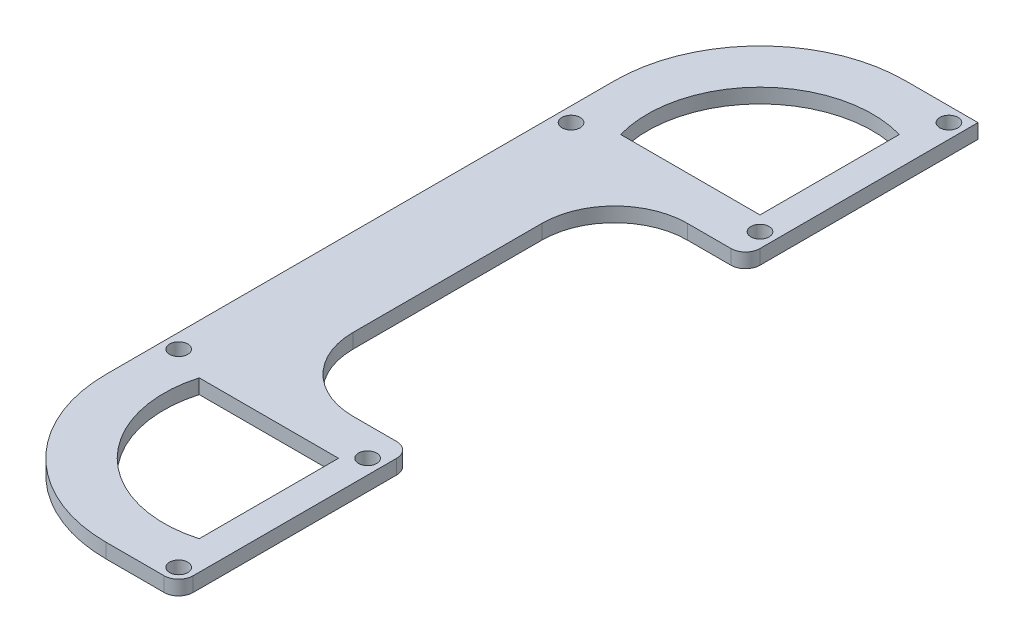
ISO-10303-21;
HEADER;
FILE_DESCRIPTION(('STEP AP214'),'2;1');
FILE_NAME('part.step','',(''),(''),'','','');
FILE_SCHEMA(('AUTOMOTIVE_DESIGN { 1 0 10303 214 1 1 1 1 }'));
ENDSEC;
DATA;
#1=APPLICATION_CONTEXT('core data for automotive mechanical design processes');
#2=APPLICATION_PROTOCOL_DEFINITION('international standard','automotive_design',2000,#1);
#3=PRODUCT_CONTEXT('',#1,'mechanical');
#4=PRODUCT('Part','Part','',(#3));
#5=PRODUCT_RELATED_PRODUCT_CATEGORY('part','',(#4));
#6=PRODUCT_DEFINITION_FORMATION('','',#4);
#7=PRODUCT_DEFINITION_CONTEXT('part definition',#1,'design');
#8=PRODUCT_DEFINITION('design','',#6,#7);
#9=PRODUCT_DEFINITION_SHAPE('','',#8);
#10=(LENGTH_UNIT() NAMED_UNIT(*) SI_UNIT(.MILLI.,.METRE.));
#11=(NAMED_UNIT(*) PLANE_ANGLE_UNIT() SI_UNIT($,.RADIAN.));
#12=(NAMED_UNIT(*) SI_UNIT($,.STERADIAN.) SOLID_ANGLE_UNIT());
#13=UNCERTAINTY_MEASURE_WITH_UNIT(LENGTH_MEASURE(1.E-05),#10,'distance_accuracy_value','');
#14=(GEOMETRIC_REPRESENTATION_CONTEXT(3) GLOBAL_UNCERTAINTY_ASSIGNED_CONTEXT((#13)) GLOBAL_UNIT_ASSIGNED_CONTEXT((#10,
#11,#12)) REPRESENTATION_CONTEXT('',''));
#15=CARTESIAN_POINT('',(0.,0.,0.));
#16=DIRECTION('',(0.,0.,1.));
#17=DIRECTION('',(1.,0.,0.));
#18=AXIS2_PLACEMENT_3D('',#15,#16,#17);
#19=CARTESIAN_POINT('',(15.,2.,-55.));
#20=DIRECTION('',(-1.,0.,0.));
#21=DIRECTION('',(0.,0.,1.));
#22=AXIS2_PLACEMENT_3D('',#19,#20,#21);
#23=PLANE('',#22);
#24=DIRECTION('',(0.,0.,-1.));
#25=VECTOR('',#24,1.);
#26=CARTESIAN_POINT('',(15.,2.,-55.));
#27=LINE('',#26,#25);
#28=CARTESIAN_POINT('',(15.,2.,-25.));
#29=VERTEX_POINT('',#28);
#30=CARTESIAN_POINT('',(15.,2.,-55.));
#31=VERTEX_POINT('',#30);
#32=EDGE_CURVE('E308',#29,#31,#27,.T.);
#33=ORIENTED_EDGE('',*,*,#32,.F.);
#34=DIRECTION('',(0.,1.,0.));
#35=VECTOR('',#34,1.);
#36=CARTESIAN_POINT('',(15.,2.,-25.));
#37=LINE('',#36,#35);
#38=CARTESIAN_POINT('',(15.,0.,-25.));
#39=VERTEX_POINT('',#38);
#40=EDGE_CURVE('E430',#29,#39,#37,.F.);
#41=ORIENTED_EDGE('',*,*,#40,.T.);
#42=DIRECTION('',(0.,0.,-1.));
#43=VECTOR('',#42,1.);
#44=CARTESIAN_POINT('',(15.,0.,-55.));
#45=LINE('',#44,#43);
#46=CARTESIAN_POINT('',(15.,0.,-55.));
#47=VERTEX_POINT('',#46);
#48=EDGE_CURVE('E299',#39,#47,#45,.T.);
#49=ORIENTED_EDGE('',*,*,#48,.T.);
#50=DIRECTION('',(0.,-1.,0.));
#51=VECTOR('',#50,1.);
#52=CARTESIAN_POINT('',(15.,2.,-55.));
#53=LINE('',#52,#51);
#54=EDGE_CURVE('E320',#31,#47,#53,.T.);
#55=ORIENTED_EDGE('',*,*,#54,.F.);
#56=EDGE_LOOP('',(#33,#41,#49,#55));
#57=FACE_BOUND('',#56,.T.);
#58=ADVANCED_FACE('F38',(#57),#23,.F.);
#59=CARTESIAN_POINT('',(15.,0.,53.));
#60=VERTEX_POINT('',#59);
#61=CARTESIAN_POINT('',(15.,0.,25.));
#62=VERTEX_POINT('',#61);
#63=EDGE_CURVE('E321',#60,#62,#45,.T.);
#64=ORIENTED_EDGE('',*,*,#63,.T.);
#65=DIRECTION('',(0.,1.,0.));
#66=VECTOR('',#65,1.);
#67=CARTESIAN_POINT('',(15.,2.,25.));
#68=LINE('',#67,#66);
#69=CARTESIAN_POINT('',(15.,2.,25.));
#70=VERTEX_POINT('',#69);
#71=EDGE_CURVE('E407',#62,#70,#68,.T.);
#72=ORIENTED_EDGE('',*,*,#71,.T.);
#73=CARTESIAN_POINT('',(15.,2.,53.));
#74=VERTEX_POINT('',#73);
#75=EDGE_CURVE('E303',#74,#70,#27,.T.);
#76=ORIENTED_EDGE('',*,*,#75,.F.);
#77=DIRECTION('',(0.,-1.,0.));
#78=VECTOR('',#77,1.);
#79=CARTESIAN_POINT('',(15.,2.,53.));
#80=LINE('',#79,#78);
#81=EDGE_CURVE('E366',#74,#60,#80,.T.);
#82=ORIENTED_EDGE('',*,*,#81,.T.);
#83=EDGE_LOOP('',(#64,#72,#76,#82));
#84=FACE_BOUND('',#83,.T.);
#85=ADVANCED_FACE('F466',(#84),#23,.F.);
#86=CARTESIAN_POINT('',(-15.,2.,-55.));
#87=DIRECTION('',(0.,0.,1.));
#88=DIRECTION('',(1.,0.,0.));
#89=AXIS2_PLACEMENT_3D('',#86,#87,#88);
#90=PLANE('',#89);
#91=DIRECTION('',(-1.,0.,0.));
#92=VECTOR('',#91,1.);
#93=CARTESIAN_POINT('',(-15.,0.,-55.));
#94=LINE('',#93,#92);
#95=CARTESIAN_POINT('',(5.,0.,-55.));
#96=VERTEX_POINT('',#95);
#97=EDGE_CURVE('E325',#47,#96,#94,.T.);
#98=ORIENTED_EDGE('',*,*,#97,.T.);
#99=DIRECTION('',(0.,-1.,0.));
#100=VECTOR('',#99,1.);
#101=CARTESIAN_POINT('',(5.,2.,-55.));
#102=LINE('',#101,#100);
#103=CARTESIAN_POINT('',(5.,2.,-55.));
#104=VERTEX_POINT('',#103);
#105=EDGE_CURVE('E363',#96,#104,#102,.F.);
#106=ORIENTED_EDGE('',*,*,#105,.T.);
#107=DIRECTION('',(-1.,0.,0.));
#108=VECTOR('',#107,1.);
#109=CARTESIAN_POINT('',(-15.,2.,-55.));
#110=LINE('',#109,#108);
#111=EDGE_CURVE('E307',#31,#104,#110,.T.);
#112=ORIENTED_EDGE('',*,*,#111,.F.);
#113=ORIENTED_EDGE('',*,*,#54,.T.);
#114=EDGE_LOOP('',(#98,#106,#112,#113));
#115=FACE_BOUND('',#114,.T.);
#116=ADVANCED_FACE('F473',(#115),#90,.F.);
#117=CARTESIAN_POINT('',(-15.,2.,-55.));
#118=DIRECTION('',(1.,0.,0.));
#119=DIRECTION('',(0.,0.,-1.));
#120=AXIS2_PLACEMENT_3D('',#117,#118,#119);
#121=PLANE('',#120);
#122=DIRECTION('',(0.,0.,1.));
#123=VECTOR('',#122,1.);
#124=CARTESIAN_POINT('',(-15.,0.,-55.));
#125=LINE('',#124,#123);
#126=CARTESIAN_POINT('',(-15.,0.,-35.));
#127=VERTEX_POINT('',#126);
#128=CARTESIAN_POINT('',(-15.,0.,35.));
#129=VERTEX_POINT('',#128);
#130=EDGE_CURVE('E329',#127,#129,#125,.T.);
#131=ORIENTED_EDGE('',*,*,#130,.T.);
#132=DIRECTION('',(0.,-1.,0.));
#133=VECTOR('',#132,1.);
#134=CARTESIAN_POINT('',(-15.,2.,35.));
#135=LINE('',#134,#133);
#136=CARTESIAN_POINT('',(-15.,2.,35.));
#137=VERTEX_POINT('',#136);
#138=EDGE_CURVE('E354',#129,#137,#135,.F.);
#139=ORIENTED_EDGE('',*,*,#138,.T.);
#140=DIRECTION('',(0.,0.,1.));
#141=VECTOR('',#140,1.);
#142=CARTESIAN_POINT('',(-15.,2.,-55.));
#143=LINE('',#142,#141);
#144=CARTESIAN_POINT('',(-15.,2.,-35.));
#145=VERTEX_POINT('',#144);
#146=EDGE_CURVE('E312',#145,#137,#143,.T.);
#147=ORIENTED_EDGE('',*,*,#146,.F.);
#148=DIRECTION('',(0.,-1.,0.));
#149=VECTOR('',#148,1.);
#150=CARTESIAN_POINT('',(-15.,2.,-35.));
#151=LINE('',#150,#149);
#152=EDGE_CURVE('E350',#145,#127,#151,.T.);
#153=ORIENTED_EDGE('',*,*,#152,.T.);
#154=EDGE_LOOP('',(#131,#139,#147,#153));
#155=FACE_BOUND('',#154,.T.);
#156=ADVANCED_FACE('F529',(#155),#121,.F.);
#157=CARTESIAN_POINT('',(-15.,2.,55.));
#158=DIRECTION('',(0.,0.,-1.));
#159=DIRECTION('',(-1.,0.,0.));
#160=AXIS2_PLACEMENT_3D('',#157,#158,#159);
#161=PLANE('',#160);
#162=DIRECTION('',(1.,0.,0.));
#163=VECTOR('',#162,1.);
#164=CARTESIAN_POINT('',(-15.,0.,55.));
#165=LINE('',#164,#163);
#166=CARTESIAN_POINT('',(5.,0.,55.));
#167=VERTEX_POINT('',#166);
#168=CARTESIAN_POINT('',(13.,0.,55.));
#169=VERTEX_POINT('',#168);
#170=EDGE_CURVE('E333',#167,#169,#165,.T.);
#171=ORIENTED_EDGE('',*,*,#170,.T.);
#172=DIRECTION('',(0.,-1.,0.));
#173=VECTOR('',#172,1.);
#174=CARTESIAN_POINT('',(13.,2.,55.));
#175=LINE('',#174,#173);
#176=CARTESIAN_POINT('',(13.,2.,55.));
#177=VERTEX_POINT('',#176);
#178=EDGE_CURVE('E373',#169,#177,#175,.F.);
#179=ORIENTED_EDGE('',*,*,#178,.T.);
#180=DIRECTION('',(1.,0.,0.));
#181=VECTOR('',#180,1.);
#182=CARTESIAN_POINT('',(-15.,2.,55.));
#183=LINE('',#182,#181);
#184=CARTESIAN_POINT('',(5.,2.,55.));
#185=VERTEX_POINT('',#184);
#186=EDGE_CURVE('E316',#185,#177,#183,.T.);
#187=ORIENTED_EDGE('',*,*,#186,.F.);
#188=DIRECTION('',(0.,-1.,0.));
#189=VECTOR('',#188,1.);
#190=CARTESIAN_POINT('',(5.,2.,55.));
#191=LINE('',#190,#189);
#192=EDGE_CURVE('E340',#185,#167,#191,.T.);
#193=ORIENTED_EDGE('',*,*,#192,.T.);
#194=EDGE_LOOP('',(#171,#179,#187,#193));
#195=FACE_BOUND('',#194,.T.);
#196=ADVANCED_FACE('F522',(#195),#161,.F.);
#197=CARTESIAN_POINT('',(0.,2.,0.));
#198=DIRECTION('',(0.,1.,0.));
#199=DIRECTION('',(0.,0.,1.));
#200=AXIS2_PLACEMENT_3D('',#197,#198,#199);
#201=PLANE('',#200);
#202=CARTESIAN_POINT('',(6.73520171686994,2.,-33.2647982831301));
#203=DIRECTION('',(0.,1.,0.));
#204=DIRECTION('',(0.,0.,1.));
#205=AXIS2_PLACEMENT_3D('',#202,#203,#204);
#206=CIRCLE('',#205,15.5048519224201);
#207=CARTESIAN_POINT('',(11.,2.,-48.1715728752538));
#208=VERTEX_POINT('',#207);
#209=CARTESIAN_POINT('',(-8.1715728752538,2.,-29.));
#210=VERTEX_POINT('',#209);
#211=EDGE_CURVE('E54',#208,#210,#206,.T.);
#212=ORIENTED_EDGE('',*,*,#211,.F.);
#213=DIRECTION('',(0.,0.,-1.));
#214=VECTOR('',#213,1.);
#215=CARTESIAN_POINT('',(11.,2.,-48.1715728752538));
#216=LINE('',#215,#214);
#217=CARTESIAN_POINT('',(11.,2.,-29.));
#218=VERTEX_POINT('',#217);
#219=EDGE_CURVE('E189',#218,#208,#216,.T.);
#220=ORIENTED_EDGE('',*,*,#219,.F.);
#221=DIRECTION('',(1.,0.,0.));
#222=VECTOR('',#221,1.);
#223=CARTESIAN_POINT('',(11.,2.,-29.));
#224=LINE('',#223,#222);
#225=EDGE_CURVE('E198',#210,#218,#224,.T.);
#226=ORIENTED_EDGE('',*,*,#225,.F.);
#227=EDGE_LOOP('',(#212,#220,#226));
#228=FACE_BOUND('',#227,.T.);
#229=CARTESIAN_POINT('',(6.73520171686994,2.,33.2647982831301));
#230=DIRECTION('',(0.,1.,0.));
#231=DIRECTION('',(0.,0.,-1.));
#232=AXIS2_PLACEMENT_3D('',#229,#230,#231);
#233=CIRCLE('',#232,15.5048519224201);
#234=CARTESIAN_POINT('',(-8.1715728752538,2.,29.));
#235=VERTEX_POINT('',#234);
#236=CARTESIAN_POINT('',(11.,2.,48.1715728752538));
#237=VERTEX_POINT('',#236);
#238=EDGE_CURVE('E62',#235,#237,#233,.T.);
#239=ORIENTED_EDGE('',*,*,#238,.F.);
#240=DIRECTION('',(-1.,0.,0.));
#241=VECTOR('',#240,1.);
#242=CARTESIAN_POINT('',(11.,2.,29.));
#243=LINE('',#242,#241);
#244=CARTESIAN_POINT('',(11.,2.,29.));
#245=VERTEX_POINT('',#244);
#246=EDGE_CURVE('E220',#245,#235,#243,.T.);
#247=ORIENTED_EDGE('',*,*,#246,.F.);
#248=DIRECTION('',(0.,0.,-1.));
#249=VECTOR('',#248,1.);
#250=CARTESIAN_POINT('',(11.,2.,48.1715728752538));
#251=LINE('',#250,#249);
#252=EDGE_CURVE('E216',#237,#245,#251,.T.);
#253=ORIENTED_EDGE('',*,*,#252,.F.);
#254=EDGE_LOOP('',(#239,#247,#253));
#255=FACE_BOUND('',#254,.T.);
#256=ORIENTED_EDGE('',*,*,#75,.T.);
#257=CARTESIAN_POINT('',(13.,2.,25.));
#258=DIRECTION('',(0.,1.,0.));
#259=DIRECTION('',(0.,0.,1.));
#260=AXIS2_PLACEMENT_3D('',#257,#258,#259);
#261=CIRCLE('',#260,2.);
#262=CARTESIAN_POINT('',(13.,2.,23.));
#263=VERTEX_POINT('',#262);
#264=EDGE_CURVE('E414',#70,#263,#261,.T.);
#265=ORIENTED_EDGE('',*,*,#264,.T.);
#266=DIRECTION('',(1.,0.,0.));
#267=VECTOR('',#266,1.);
#268=CARTESIAN_POINT('',(-2.99999999999999,2.,23.));
#269=LINE('',#268,#267);
#270=CARTESIAN_POINT('',(7.00000000000001,2.,23.));
#271=VERTEX_POINT('',#270);
#272=EDGE_CURVE('E237',#271,#263,#269,.T.);
#273=ORIENTED_EDGE('',*,*,#272,.F.);
#274=CARTESIAN_POINT('',(7.,2.,13.));
#275=DIRECTION('',(0.,1.,0.));
#276=DIRECTION('',(0.,0.,1.));
#277=AXIS2_PLACEMENT_3D('',#274,#275,#276);
#278=CIRCLE('',#277,10.);
#279=CARTESIAN_POINT('',(-3.,2.,13.));
#280=VERTEX_POINT('',#279);
#281=EDGE_CURVE('E394',#271,#280,#278,.F.);
#282=ORIENTED_EDGE('',*,*,#281,.T.);
#283=DIRECTION('',(0.,0.,1.));
#284=VECTOR('',#283,1.);
#285=CARTESIAN_POINT('',(-3.,2.,-23.));
#286=LINE('',#285,#284);
#287=CARTESIAN_POINT('',(-3.,2.,-13.));
#288=VERTEX_POINT('',#287);
#289=EDGE_CURVE('E248',#288,#280,#286,.T.);
#290=ORIENTED_EDGE('',*,*,#289,.F.);
#291=CARTESIAN_POINT('',(7.,2.,-13.));
#292=DIRECTION('',(0.,1.,0.));
#293=DIRECTION('',(0.,0.,1.));
#294=AXIS2_PLACEMENT_3D('',#291,#292,#293);
#295=CIRCLE('',#294,10.);
#296=CARTESIAN_POINT('',(7.00000000000001,2.,-23.));
#297=VERTEX_POINT('',#296);
#298=EDGE_CURVE('E400',#288,#297,#295,.F.);
#299=ORIENTED_EDGE('',*,*,#298,.T.);
#300=DIRECTION('',(-1.,0.,0.));
#301=VECTOR('',#300,1.);
#302=CARTESIAN_POINT('',(15.,2.,-23.));
#303=LINE('',#302,#301);
#304=CARTESIAN_POINT('',(13.,2.,-23.));
#305=VERTEX_POINT('',#304);
#306=EDGE_CURVE('E212',#305,#297,#303,.T.);
#307=ORIENTED_EDGE('',*,*,#306,.F.);
#308=CARTESIAN_POINT('',(13.,2.,-25.));
#309=DIRECTION('',(0.,1.,0.));
#310=DIRECTION('',(0.,0.,1.));
#311=AXIS2_PLACEMENT_3D('',#308,#309,#310);
#312=CIRCLE('',#311,2.);
#313=EDGE_CURVE('E411',#305,#29,#312,.T.);
#314=ORIENTED_EDGE('',*,*,#313,.T.);
#315=ORIENTED_EDGE('',*,*,#32,.T.);
#316=ORIENTED_EDGE('',*,*,#111,.T.);
#317=CARTESIAN_POINT('',(5.,2.,-35.));
#318=DIRECTION('',(0.,1.,0.));
#319=DIRECTION('',(0.,0.,1.));
#320=AXIS2_PLACEMENT_3D('',#317,#318,#319);
#321=CIRCLE('',#320,20.);
#322=EDGE_CURVE('E357',#104,#145,#321,.T.);
#323=ORIENTED_EDGE('',*,*,#322,.T.);
#324=ORIENTED_EDGE('',*,*,#146,.T.);
#325=CARTESIAN_POINT('',(5.,2.,35.));
#326=DIRECTION('',(0.,1.,0.));
#327=DIRECTION('',(0.,0.,1.));
#328=AXIS2_PLACEMENT_3D('',#325,#326,#327);
#329=CIRCLE('',#328,20.);
#330=EDGE_CURVE('E360',#137,#185,#329,.T.);
#331=ORIENTED_EDGE('',*,*,#330,.T.);
#332=ORIENTED_EDGE('',*,*,#186,.T.);
#333=CARTESIAN_POINT('',(13.,2.,53.));
#334=DIRECTION('',(0.,1.,0.));
#335=DIRECTION('',(0.,0.,1.));
#336=AXIS2_PLACEMENT_3D('',#333,#334,#335);
#337=CIRCLE('',#336,2.);
#338=EDGE_CURVE('E376',#177,#74,#337,.T.);
#339=ORIENTED_EDGE('',*,*,#338,.T.);
#340=EDGE_LOOP('',(#256,#265,#273,#282,#290,#299,#307,#314,#315,#316,#323,#324,#331,#332,#339));
#341=FACE_BOUND('',#340,.T.);
#342=CARTESIAN_POINT('',(-13.,2.,-27.));
#343=DIRECTION('',(0.,1.,0.));
#344=DIRECTION('',(0.,0.,-1.));
#345=AXIS2_PLACEMENT_3D('',#342,#343,#344);
#346=CIRCLE('',#345,1.25);
#347=CARTESIAN_POINT('',(-13.,2.,-28.25));
#348=VERTEX_POINT('',#347);
#349=EDGE_CURVE('E268',#348,#348,#346,.T.);
#350=ORIENTED_EDGE('',*,*,#349,.F.);
#351=EDGE_LOOP('',(#350));
#352=FACE_BOUND('',#351,.T.);
#353=CARTESIAN_POINT('',(13.,2.,-53.));
#354=DIRECTION('',(0.,1.,0.));
#355=DIRECTION('',(0.,0.,1.));
#356=AXIS2_PLACEMENT_3D('',#353,#354,#355);
#357=CIRCLE('',#356,1.25);
#358=CARTESIAN_POINT('',(13.,2.,-51.75));
#359=VERTEX_POINT('',#358);
#360=EDGE_CURVE('E276',#359,#359,#357,.T.);
#361=ORIENTED_EDGE('',*,*,#360,.F.);
#362=EDGE_LOOP('',(#361));
#363=FACE_BOUND('',#362,.T.);
#364=CARTESIAN_POINT('',(13.,2.,53.));
#365=DIRECTION('',(0.,1.,0.));
#366=DIRECTION('',(0.,0.,-1.));
#367=AXIS2_PLACEMENT_3D('',#364,#365,#366);
#368=CIRCLE('',#367,1.25);
#369=CARTESIAN_POINT('',(13.,2.,51.75));
#370=VERTEX_POINT('',#369);
#371=EDGE_CURVE('E284',#370,#370,#368,.T.);
#372=ORIENTED_EDGE('',*,*,#371,.F.);
#373=EDGE_LOOP('',(#372));
#374=FACE_BOUND('',#373,.T.);
#375=CARTESIAN_POINT('',(-13.,2.,27.));
#376=DIRECTION('',(0.,1.,0.));
#377=DIRECTION('',(0.,0.,1.));
#378=AXIS2_PLACEMENT_3D('',#375,#376,#377);
#379=CIRCLE('',#378,1.25);
#380=CARTESIAN_POINT('',(-13.,2.,28.25));
#381=VERTEX_POINT('',#380);
#382=EDGE_CURVE('E259',#381,#381,#379,.T.);
#383=ORIENTED_EDGE('',*,*,#382,.F.);
#384=EDGE_LOOP('',(#383));
#385=FACE_BOUND('',#384,.T.);
#386=CARTESIAN_POINT('',(13.,2.,27.));
#387=DIRECTION('',(0.,1.,0.));
#388=DIRECTION('',(0.,0.,-1.));
#389=AXIS2_PLACEMENT_3D('',#386,#387,#388);
#390=CIRCLE('',#389,1.25);
#391=CARTESIAN_POINT('',(13.,2.,25.75));
#392=VERTEX_POINT('',#391);
#393=EDGE_CURVE('E245',#392,#392,#390,.T.);
#394=ORIENTED_EDGE('',*,*,#393,.F.);
#395=EDGE_LOOP('',(#394));
#396=FACE_BOUND('',#395,.T.);
#397=CARTESIAN_POINT('',(13.,2.,-27.));
#398=DIRECTION('',(0.,1.,0.));
#399=DIRECTION('',(0.,0.,1.));
#400=AXIS2_PLACEMENT_3D('',#397,#398,#399);
#401=CIRCLE('',#400,1.25);
#402=CARTESIAN_POINT('',(13.,2.,-25.75));
#403=VERTEX_POINT('',#402);
#404=EDGE_CURVE('E267',#403,#403,#401,.T.);
#405=ORIENTED_EDGE('',*,*,#404,.F.);
#406=EDGE_LOOP('',(#405));
#407=FACE_BOUND('',#406,.T.);
#408=ADVANCED_FACE('F203',(#228,#255,#341,#352,#363,#374,#385,#396,#407),#201,.T.);
#409=CARTESIAN_POINT('',(0.,0.,0.));
#410=DIRECTION('',(0.,1.,0.));
#411=DIRECTION('',(0.,0.,1.));
#412=AXIS2_PLACEMENT_3D('',#409,#410,#411);
#413=PLANE('',#412);
#414=DIRECTION('',(0.,0.,-1.));
#415=VECTOR('',#414,1.);
#416=CARTESIAN_POINT('',(11.,0.,0.));
#417=LINE('',#416,#415);
#418=CARTESIAN_POINT('',(11.,0.,-29.));
#419=VERTEX_POINT('',#418);
#420=CARTESIAN_POINT('',(11.,0.,-48.1715728752538));
#421=VERTEX_POINT('',#420);
#422=EDGE_CURVE('E47',#419,#421,#417,.T.);
#423=ORIENTED_EDGE('',*,*,#422,.T.);
#424=CARTESIAN_POINT('',(6.73520171686994,0.,-33.2647982831301));
#425=DIRECTION('',(0.,1.,0.));
#426=DIRECTION('',(0.,0.,1.));
#427=AXIS2_PLACEMENT_3D('',#424,#425,#426);
#428=CIRCLE('',#427,15.5048519224201);
#429=CARTESIAN_POINT('',(-8.1715728752538,0.,-29.));
#430=VERTEX_POINT('',#429);
#431=EDGE_CURVE('E11',#421,#430,#428,.T.);
#432=ORIENTED_EDGE('',*,*,#431,.T.);
#433=DIRECTION('',(1.,0.,0.));
#434=VECTOR('',#433,1.);
#435=CARTESIAN_POINT('',(0.,0.,-29.));
#436=LINE('',#435,#434);
#437=EDGE_CURVE('E445',#430,#419,#436,.T.);
#438=ORIENTED_EDGE('',*,*,#437,.T.);
#439=EDGE_LOOP('',(#423,#432,#438));
#440=FACE_BOUND('',#439,.T.);
#441=DIRECTION('',(-1.,0.,0.));
#442=VECTOR('',#441,1.);
#443=CARTESIAN_POINT('',(0.,0.,29.));
#444=LINE('',#443,#442);
#445=CARTESIAN_POINT('',(11.,0.,29.));
#446=VERTEX_POINT('',#445);
#447=CARTESIAN_POINT('',(-8.1715728752538,0.,29.));
#448=VERTEX_POINT('',#447);
#449=EDGE_CURVE('E437',#446,#448,#444,.T.);
#450=ORIENTED_EDGE('',*,*,#449,.T.);
#451=CARTESIAN_POINT('',(6.73520171686994,0.,33.2647982831301));
#452=DIRECTION('',(0.,1.,0.));
#453=DIRECTION('',(0.,0.,1.));
#454=AXIS2_PLACEMENT_3D('',#451,#452,#453);
#455=CIRCLE('',#454,15.5048519224201);
#456=CARTESIAN_POINT('',(11.,0.,48.1715728752538));
#457=VERTEX_POINT('',#456);
#458=EDGE_CURVE('E441',#448,#457,#455,.T.);
#459=ORIENTED_EDGE('',*,*,#458,.T.);
#460=DIRECTION('',(0.,0.,-1.));
#461=VECTOR('',#460,1.);
#462=CARTESIAN_POINT('',(11.,0.,0.));
#463=LINE('',#462,#461);
#464=EDGE_CURVE('E433',#457,#446,#463,.T.);
#465=ORIENTED_EDGE('',*,*,#464,.T.);
#466=EDGE_LOOP('',(#450,#459,#465));
#467=FACE_BOUND('',#466,.T.);
#468=DIRECTION('',(1.,0.,0.));
#469=VECTOR('',#468,1.);
#470=CARTESIAN_POINT('',(-2.99999999999999,0.,23.));
#471=LINE('',#470,#469);
#472=CARTESIAN_POINT('',(7.00000000000001,0.,23.));
#473=VERTEX_POINT('',#472);
#474=CARTESIAN_POINT('',(13.,0.,23.));
#475=VERTEX_POINT('',#474);
#476=EDGE_CURVE('E241',#473,#475,#471,.T.);
#477=ORIENTED_EDGE('',*,*,#476,.T.);
#478=CARTESIAN_POINT('',(13.,0.,25.));
#479=DIRECTION('',(0.,1.,0.));
#480=DIRECTION('',(0.,0.,1.));
#481=AXIS2_PLACEMENT_3D('',#478,#479,#480);
#482=CIRCLE('',#481,2.);
#483=EDGE_CURVE('E423',#475,#62,#482,.F.);
#484=ORIENTED_EDGE('',*,*,#483,.T.);
#485=ORIENTED_EDGE('',*,*,#63,.F.);
#486=CARTESIAN_POINT('',(13.,0.,53.));
#487=DIRECTION('',(0.,1.,0.));
#488=DIRECTION('',(0.,0.,1.));
#489=AXIS2_PLACEMENT_3D('',#486,#487,#488);
#490=CIRCLE('',#489,2.);
#491=EDGE_CURVE('E370',#60,#169,#490,.F.);
#492=ORIENTED_EDGE('',*,*,#491,.T.);
#493=ORIENTED_EDGE('',*,*,#170,.F.);
#494=CARTESIAN_POINT('',(5.,0.,35.));
#495=DIRECTION('',(0.,1.,0.));
#496=DIRECTION('',(0.,0.,1.));
#497=AXIS2_PLACEMENT_3D('',#494,#495,#496);
#498=CIRCLE('',#497,20.);
#499=EDGE_CURVE('E347',#167,#129,#498,.F.);
#500=ORIENTED_EDGE('',*,*,#499,.T.);
#501=ORIENTED_EDGE('',*,*,#130,.F.);
#502=CARTESIAN_POINT('',(5.,0.,-35.));
#503=DIRECTION('',(0.,1.,0.));
#504=DIRECTION('',(0.,0.,1.));
#505=AXIS2_PLACEMENT_3D('',#502,#503,#504);
#506=CIRCLE('',#505,20.);
#507=EDGE_CURVE('E344',#127,#96,#506,.F.);
#508=ORIENTED_EDGE('',*,*,#507,.T.);
#509=ORIENTED_EDGE('',*,*,#97,.F.);
#510=ORIENTED_EDGE('',*,*,#48,.F.);
#511=CARTESIAN_POINT('',(13.,0.,-25.));
#512=DIRECTION('',(0.,1.,0.));
#513=DIRECTION('',(0.,0.,1.));
#514=AXIS2_PLACEMENT_3D('',#511,#512,#513);
#515=CIRCLE('',#514,2.);
#516=CARTESIAN_POINT('',(13.,0.,-23.));
#517=VERTEX_POINT('',#516);
#518=EDGE_CURVE('E420',#39,#517,#515,.F.);
#519=ORIENTED_EDGE('',*,*,#518,.T.);
#520=DIRECTION('',(-1.,0.,0.));
#521=VECTOR('',#520,1.);
#522=CARTESIAN_POINT('',(15.,0.,-23.));
#523=LINE('',#522,#521);
#524=CARTESIAN_POINT('',(7.00000000000001,0.,-23.));
#525=VERTEX_POINT('',#524);
#526=EDGE_CURVE('E233',#517,#525,#523,.T.);
#527=ORIENTED_EDGE('',*,*,#526,.T.);
#528=CARTESIAN_POINT('',(7.,0.,-13.));
#529=DIRECTION('',(0.,1.,0.));
#530=DIRECTION('',(0.,0.,1.));
#531=AXIS2_PLACEMENT_3D('',#528,#529,#530);
#532=CIRCLE('',#531,10.);
#533=CARTESIAN_POINT('',(-3.,0.,-13.));
#534=VERTEX_POINT('',#533);
#535=EDGE_CURVE('E404',#525,#534,#532,.T.);
#536=ORIENTED_EDGE('',*,*,#535,.T.);
#537=DIRECTION('',(0.,0.,1.));
#538=VECTOR('',#537,1.);
#539=CARTESIAN_POINT('',(-3.,0.,-23.));
#540=LINE('',#539,#538);
#541=CARTESIAN_POINT('',(-3.,0.,13.));
#542=VERTEX_POINT('',#541);
#543=EDGE_CURVE('E236',#534,#542,#540,.T.);
#544=ORIENTED_EDGE('',*,*,#543,.T.);
#545=CARTESIAN_POINT('',(7.,0.,13.));
#546=DIRECTION('',(0.,1.,0.));
#547=DIRECTION('',(0.,0.,1.));
#548=AXIS2_PLACEMENT_3D('',#545,#546,#547);
#549=CIRCLE('',#548,10.);
#550=EDGE_CURVE('E397',#542,#473,#549,.T.);
#551=ORIENTED_EDGE('',*,*,#550,.T.);
#552=EDGE_LOOP('',(#477,#484,#485,#492,#493,#500,#501,#508,#509,#510,#519,#527,#536,#544,#551));
#553=FACE_BOUND('',#552,.T.);
#554=CARTESIAN_POINT('',(-13.,0.,-27.));
#555=DIRECTION('',(0.,1.,0.));
#556=DIRECTION('',(0.,0.,-1.));
#557=AXIS2_PLACEMENT_3D('',#554,#555,#556);
#558=CIRCLE('',#557,1.25);
#559=CARTESIAN_POINT('',(-13.,0.,-28.25));
#560=VERTEX_POINT('',#559);
#561=EDGE_CURVE('E263',#560,#560,#558,.T.);
#562=ORIENTED_EDGE('',*,*,#561,.T.);
#563=EDGE_LOOP('',(#562));
#564=FACE_BOUND('',#563,.T.);
#565=CARTESIAN_POINT('',(13.,0.,-53.));
#566=DIRECTION('',(0.,1.,0.));
#567=DIRECTION('',(0.,0.,1.));
#568=AXIS2_PLACEMENT_3D('',#565,#566,#567);
#569=CIRCLE('',#568,1.25);
#570=CARTESIAN_POINT('',(13.,0.,-51.75));
#571=VERTEX_POINT('',#570);
#572=EDGE_CURVE('E272',#571,#571,#569,.T.);
#573=ORIENTED_EDGE('',*,*,#572,.T.);
#574=EDGE_LOOP('',(#573));
#575=FACE_BOUND('',#574,.T.);
#576=CARTESIAN_POINT('',(13.,0.,53.));
#577=DIRECTION('',(0.,1.,0.));
#578=DIRECTION('',(0.,0.,-1.));
#579=AXIS2_PLACEMENT_3D('',#576,#577,#578);
#580=CIRCLE('',#579,1.25);
#581=CARTESIAN_POINT('',(13.,0.,51.75));
#582=VERTEX_POINT('',#581);
#583=EDGE_CURVE('E280',#582,#582,#580,.T.);
#584=ORIENTED_EDGE('',*,*,#583,.T.);
#585=EDGE_LOOP('',(#584));
#586=FACE_BOUND('',#585,.T.);
#587=CARTESIAN_POINT('',(-13.,0.,27.));
#588=DIRECTION('',(0.,1.,0.));
#589=DIRECTION('',(0.,0.,1.));
#590=AXIS2_PLACEMENT_3D('',#587,#588,#589);
#591=CIRCLE('',#590,1.25);
#592=CARTESIAN_POINT('',(-13.,0.,28.25));
#593=VERTEX_POINT('',#592);
#594=EDGE_CURVE('E288',#593,#593,#591,.T.);
#595=ORIENTED_EDGE('',*,*,#594,.T.);
#596=EDGE_LOOP('',(#595));
#597=FACE_BOUND('',#596,.T.);
#598=CARTESIAN_POINT('',(13.,0.,27.));
#599=DIRECTION('',(0.,1.,0.));
#600=DIRECTION('',(0.,0.,-1.));
#601=AXIS2_PLACEMENT_3D('',#598,#599,#600);
#602=CIRCLE('',#601,1.25);
#603=CARTESIAN_POINT('',(13.,0.,25.75));
#604=VERTEX_POINT('',#603);
#605=EDGE_CURVE('E255',#604,#604,#602,.T.);
#606=ORIENTED_EDGE('',*,*,#605,.T.);
#607=EDGE_LOOP('',(#606));
#608=FACE_BOUND('',#607,.T.);
#609=CARTESIAN_POINT('',(13.,0.,-27.));
#610=DIRECTION('',(0.,1.,0.));
#611=DIRECTION('',(0.,0.,1.));
#612=AXIS2_PLACEMENT_3D('',#609,#610,#611);
#613=CIRCLE('',#612,1.25);
#614=CARTESIAN_POINT('',(13.,0.,-25.75));
#615=VERTEX_POINT('',#614);
#616=EDGE_CURVE('E295',#615,#615,#613,.T.);
#617=ORIENTED_EDGE('',*,*,#616,.T.);
#618=EDGE_LOOP('',(#617));
#619=FACE_BOUND('',#618,.T.);
#620=ADVANCED_FACE('F449',(#440,#467,#553,#564,#575,#586,#597,#608,#619),#413,.F.);
#621=CARTESIAN_POINT('',(13.,0.,-27.));
#622=DIRECTION('',(0.,1.,0.));
#623=DIRECTION('',(0.,0.,1.));
#624=AXIS2_PLACEMENT_3D('',#621,#622,#623);
#625=CYLINDRICAL_SURFACE('',#624,1.25);
#626=ORIENTED_EDGE('',*,*,#616,.F.);
#627=EDGE_LOOP('',(#626));
#628=FACE_BOUND('',#627,.T.);
#629=ORIENTED_EDGE('',*,*,#404,.T.);
#630=EDGE_LOOP('',(#629));
#631=FACE_BOUND('',#630,.T.);
#632=ADVANCED_FACE('F575',(#628,#631),#625,.F.);
#633=CARTESIAN_POINT('',(13.,0.,27.));
#634=DIRECTION('',(0.,1.,0.));
#635=DIRECTION('',(0.,0.,1.));
#636=AXIS2_PLACEMENT_3D('',#633,#634,#635);
#637=CYLINDRICAL_SURFACE('',#636,1.25);
#638=ORIENTED_EDGE('',*,*,#605,.F.);
#639=EDGE_LOOP('',(#638));
#640=FACE_BOUND('',#639,.T.);
#641=ORIENTED_EDGE('',*,*,#393,.T.);
#642=EDGE_LOOP('',(#641));
#643=FACE_BOUND('',#642,.T.);
#644=ADVANCED_FACE('F571',(#640,#643),#637,.F.);
#645=CARTESIAN_POINT('',(-13.,0.,27.));
#646=DIRECTION('',(0.,1.,0.));
#647=DIRECTION('',(0.,0.,1.));
#648=AXIS2_PLACEMENT_3D('',#645,#646,#647);
#649=CYLINDRICAL_SURFACE('',#648,1.25);
#650=ORIENTED_EDGE('',*,*,#594,.F.);
#651=EDGE_LOOP('',(#650));
#652=FACE_BOUND('',#651,.T.);
#653=ORIENTED_EDGE('',*,*,#382,.T.);
#654=EDGE_LOOP('',(#653));
#655=FACE_BOUND('',#654,.T.);
#656=ADVANCED_FACE('F574',(#652,#655),#649,.F.);
#657=CARTESIAN_POINT('',(13.,0.,53.));
#658=DIRECTION('',(0.,1.,0.));
#659=DIRECTION('',(0.,0.,1.));
#660=AXIS2_PLACEMENT_3D('',#657,#658,#659);
#661=CYLINDRICAL_SURFACE('',#660,1.25);
#662=ORIENTED_EDGE('',*,*,#583,.F.);
#663=EDGE_LOOP('',(#662));
#664=FACE_BOUND('',#663,.T.);
#665=ORIENTED_EDGE('',*,*,#371,.T.);
#666=EDGE_LOOP('',(#665));
#667=FACE_BOUND('',#666,.T.);
#668=ADVANCED_FACE('F583',(#664,#667),#661,.F.);
#669=CARTESIAN_POINT('',(13.,0.,-53.));
#670=DIRECTION('',(0.,1.,0.));
#671=DIRECTION('',(0.,0.,1.));
#672=AXIS2_PLACEMENT_3D('',#669,#670,#671);
#673=CYLINDRICAL_SURFACE('',#672,1.25);
#674=ORIENTED_EDGE('',*,*,#572,.F.);
#675=EDGE_LOOP('',(#674));
#676=FACE_BOUND('',#675,.T.);
#677=ORIENTED_EDGE('',*,*,#360,.T.);
#678=EDGE_LOOP('',(#677));
#679=FACE_BOUND('',#678,.T.);
#680=ADVANCED_FACE('F579',(#676,#679),#673,.F.);
#681=CARTESIAN_POINT('',(-13.,0.,-27.));
#682=DIRECTION('',(0.,1.,0.));
#683=DIRECTION('',(0.,0.,1.));
#684=AXIS2_PLACEMENT_3D('',#681,#682,#683);
#685=CYLINDRICAL_SURFACE('',#684,1.25);
#686=ORIENTED_EDGE('',*,*,#561,.F.);
#687=EDGE_LOOP('',(#686));
#688=FACE_BOUND('',#687,.T.);
#689=ORIENTED_EDGE('',*,*,#349,.T.);
#690=EDGE_LOOP('',(#689));
#691=FACE_BOUND('',#690,.T.);
#692=ADVANCED_FACE('F483',(#688,#691),#685,.F.);
#693=CARTESIAN_POINT('',(5.,2.,35.));
#694=DIRECTION('',(0.,-1.,0.));
#695=DIRECTION('',(0.,0.,-1.));
#696=AXIS2_PLACEMENT_3D('',#693,#694,#695);
#697=CYLINDRICAL_SURFACE('',#696,20.);
#698=ORIENTED_EDGE('',*,*,#330,.F.);
#699=ORIENTED_EDGE('',*,*,#138,.F.);
#700=ORIENTED_EDGE('',*,*,#499,.F.);
#701=ORIENTED_EDGE('',*,*,#192,.F.);
#702=EDGE_LOOP('',(#698,#699,#700,#701));
#703=FACE_BOUND('',#702,.T.);
#704=ADVANCED_FACE('F479',(#703),#697,.T.);
#705=CARTESIAN_POINT('',(5.,2.,-35.));
#706=DIRECTION('',(0.,-1.,0.));
#707=DIRECTION('',(0.,0.,-1.));
#708=AXIS2_PLACEMENT_3D('',#705,#706,#707);
#709=CYLINDRICAL_SURFACE('',#708,20.);
#710=ORIENTED_EDGE('',*,*,#322,.F.);
#711=ORIENTED_EDGE('',*,*,#105,.F.);
#712=ORIENTED_EDGE('',*,*,#507,.F.);
#713=ORIENTED_EDGE('',*,*,#152,.F.);
#714=EDGE_LOOP('',(#710,#711,#712,#713));
#715=FACE_BOUND('',#714,.T.);
#716=ADVANCED_FACE('F482',(#715),#709,.T.);
#717=CARTESIAN_POINT('',(13.,2.,53.));
#718=DIRECTION('',(0.,-1.,0.));
#719=DIRECTION('',(0.,0.,-1.));
#720=AXIS2_PLACEMENT_3D('',#717,#718,#719);
#721=CYLINDRICAL_SURFACE('',#720,2.);
#722=ORIENTED_EDGE('',*,*,#338,.F.);
#723=ORIENTED_EDGE('',*,*,#178,.F.);
#724=ORIENTED_EDGE('',*,*,#491,.F.);
#725=ORIENTED_EDGE('',*,*,#81,.F.);
#726=EDGE_LOOP('',(#722,#723,#724,#725));
#727=FACE_BOUND('',#726,.T.);
#728=ADVANCED_FACE('F487',(#727),#721,.T.);
#729=CARTESIAN_POINT('',(15.,0.,-23.));
#730=DIRECTION('',(0.,0.,-1.));
#731=DIRECTION('',(-1.,0.,0.));
#732=AXIS2_PLACEMENT_3D('',#729,#730,#731);
#733=PLANE('',#732);
#734=ORIENTED_EDGE('',*,*,#526,.F.);
#735=DIRECTION('',(0.,1.,0.));
#736=VECTOR('',#735,1.);
#737=CARTESIAN_POINT('',(13.,0.,-23.));
#738=LINE('',#737,#736);
#739=EDGE_CURVE('E426',#517,#305,#738,.T.);
#740=ORIENTED_EDGE('',*,*,#739,.T.);
#741=ORIENTED_EDGE('',*,*,#306,.T.);
#742=DIRECTION('',(0.,1.,0.));
#743=VECTOR('',#742,1.);
#744=CARTESIAN_POINT('',(7.00000000000001,0.,-23.));
#745=LINE('',#744,#743);
#746=EDGE_CURVE('E390',#297,#525,#745,.F.);
#747=ORIENTED_EDGE('',*,*,#746,.T.);
#748=EDGE_LOOP('',(#734,#740,#741,#747));
#749=FACE_BOUND('',#748,.T.);
#750=ADVANCED_FACE('F491',(#749),#733,.F.);
#751=CARTESIAN_POINT('',(-2.99999999999999,0.,23.));
#752=DIRECTION('',(0.,0.,1.));
#753=DIRECTION('',(1.,0.,0.));
#754=AXIS2_PLACEMENT_3D('',#751,#752,#753);
#755=PLANE('',#754);
#756=ORIENTED_EDGE('',*,*,#272,.T.);
#757=DIRECTION('',(0.,1.,0.));
#758=VECTOR('',#757,1.);
#759=CARTESIAN_POINT('',(13.,0.,23.));
#760=LINE('',#759,#758);
#761=EDGE_CURVE('E417',#263,#475,#760,.F.);
#762=ORIENTED_EDGE('',*,*,#761,.T.);
#763=ORIENTED_EDGE('',*,*,#476,.F.);
#764=DIRECTION('',(0.,1.,0.));
#765=VECTOR('',#764,1.);
#766=CARTESIAN_POINT('',(7.00000000000001,2.,23.));
#767=LINE('',#766,#765);
#768=EDGE_CURVE('E379',#473,#271,#767,.T.);
#769=ORIENTED_EDGE('',*,*,#768,.T.);
#770=EDGE_LOOP('',(#756,#762,#763,#769));
#771=FACE_BOUND('',#770,.T.);
#772=ADVANCED_FACE('F560',(#771),#755,.F.);
#773=CARTESIAN_POINT('',(-3.,0.,-23.));
#774=DIRECTION('',(-1.,0.,0.));
#775=DIRECTION('',(0.,0.,1.));
#776=AXIS2_PLACEMENT_3D('',#773,#774,#775);
#777=PLANE('',#776);
#778=ORIENTED_EDGE('',*,*,#289,.T.);
#779=DIRECTION('',(0.,1.,0.));
#780=VECTOR('',#779,1.);
#781=CARTESIAN_POINT('',(-3.,0.,13.));
#782=LINE('',#781,#780);
#783=EDGE_CURVE('E387',#280,#542,#782,.F.);
#784=ORIENTED_EDGE('',*,*,#783,.T.);
#785=ORIENTED_EDGE('',*,*,#543,.F.);
#786=DIRECTION('',(0.,1.,0.));
#787=VECTOR('',#786,1.);
#788=CARTESIAN_POINT('',(-3.,2.,-13.));
#789=LINE('',#788,#787);
#790=EDGE_CURVE('E383',#534,#288,#789,.T.);
#791=ORIENTED_EDGE('',*,*,#790,.T.);
#792=EDGE_LOOP('',(#778,#784,#785,#791));
#793=FACE_BOUND('',#792,.T.);
#794=ADVANCED_FACE('F497',(#793),#777,.F.);
#795=CARTESIAN_POINT('',(7.,0.,13.));
#796=DIRECTION('',(0.,-1.,0.));
#797=DIRECTION('',(0.,0.,-1.));
#798=AXIS2_PLACEMENT_3D('',#795,#796,#797);
#799=CYLINDRICAL_SURFACE('',#798,10.);
#800=ORIENTED_EDGE('',*,*,#550,.F.);
#801=ORIENTED_EDGE('',*,*,#783,.F.);
#802=ORIENTED_EDGE('',*,*,#281,.F.);
#803=ORIENTED_EDGE('',*,*,#768,.F.);
#804=EDGE_LOOP('',(#800,#801,#802,#803));
#805=FACE_BOUND('',#804,.T.);
#806=ADVANCED_FACE('F493',(#805),#799,.F.);
#807=CARTESIAN_POINT('',(7.,0.,-13.));
#808=DIRECTION('',(0.,-1.,0.));
#809=DIRECTION('',(0.,0.,-1.));
#810=AXIS2_PLACEMENT_3D('',#807,#808,#809);
#811=CYLINDRICAL_SURFACE('',#810,10.);
#812=ORIENTED_EDGE('',*,*,#535,.F.);
#813=ORIENTED_EDGE('',*,*,#746,.F.);
#814=ORIENTED_EDGE('',*,*,#298,.F.);
#815=ORIENTED_EDGE('',*,*,#790,.F.);
#816=EDGE_LOOP('',(#812,#813,#814,#815));
#817=FACE_BOUND('',#816,.T.);
#818=ADVANCED_FACE('F496',(#817),#811,.F.);
#819=CARTESIAN_POINT('',(13.,2.,25.));
#820=DIRECTION('',(0.,1.,0.));
#821=DIRECTION('',(0.,0.,1.));
#822=AXIS2_PLACEMENT_3D('',#819,#820,#821);
#823=CYLINDRICAL_SURFACE('',#822,2.);
#824=ORIENTED_EDGE('',*,*,#483,.F.);
#825=ORIENTED_EDGE('',*,*,#761,.F.);
#826=ORIENTED_EDGE('',*,*,#264,.F.);
#827=ORIENTED_EDGE('',*,*,#71,.F.);
#828=EDGE_LOOP('',(#824,#825,#826,#827));
#829=FACE_BOUND('',#828,.T.);
#830=ADVANCED_FACE('F500',(#829),#823,.T.);
#831=CARTESIAN_POINT('',(13.,0.,-25.));
#832=DIRECTION('',(0.,1.,0.));
#833=DIRECTION('',(0.,0.,1.));
#834=AXIS2_PLACEMENT_3D('',#831,#832,#833);
#835=CYLINDRICAL_SURFACE('',#834,2.);
#836=ORIENTED_EDGE('',*,*,#518,.F.);
#837=ORIENTED_EDGE('',*,*,#40,.F.);
#838=ORIENTED_EDGE('',*,*,#313,.F.);
#839=ORIENTED_EDGE('',*,*,#739,.F.);
#840=EDGE_LOOP('',(#836,#837,#838,#839));
#841=FACE_BOUND('',#840,.T.);
#842=ADVANCED_FACE('F40',(#841),#835,.T.);
#843=CARTESIAN_POINT('',(6.73520171686994,-8.,33.2647982831301));
#844=DIRECTION('',(0.,1.,0.));
#845=DIRECTION('',(0.,0.,1.));
#846=AXIS2_PLACEMENT_3D('',#843,#844,#845);
#847=CYLINDRICAL_SURFACE('',#846,15.5048519224201);
#848=DIRECTION('',(0.,1.,0.));
#849=VECTOR('',#848,1.);
#850=CARTESIAN_POINT('',(-8.1715728752538,-8.,29.));
#851=LINE('',#850,#849);
#852=EDGE_CURVE('E225',#448,#235,#851,.T.);
#853=ORIENTED_EDGE('',*,*,#852,.T.);
#854=ORIENTED_EDGE('',*,*,#238,.T.);
#855=DIRECTION('',(0.,1.,0.));
#856=VECTOR('',#855,1.);
#857=CARTESIAN_POINT('',(11.,-8.,48.1715728752538));
#858=LINE('',#857,#856);
#859=EDGE_CURVE('E224',#457,#237,#858,.T.);
#860=ORIENTED_EDGE('',*,*,#859,.F.);
#861=ORIENTED_EDGE('',*,*,#458,.F.);
#862=EDGE_LOOP('',(#853,#854,#860,#861));
#863=FACE_BOUND('',#862,.T.);
#864=ADVANCED_FACE('F507',(#863),#847,.F.);
#865=CARTESIAN_POINT('',(11.,-8.,29.));
#866=DIRECTION('',(0.,0.,-1.));
#867=DIRECTION('',(-1.,0.,0.));
#868=AXIS2_PLACEMENT_3D('',#865,#866,#867);
#869=PLANE('',#868);
#870=DIRECTION('',(0.,1.,0.));
#871=VECTOR('',#870,1.);
#872=CARTESIAN_POINT('',(11.,-8.,29.));
#873=LINE('',#872,#871);
#874=EDGE_CURVE('E228',#446,#245,#873,.T.);
#875=ORIENTED_EDGE('',*,*,#874,.T.);
#876=ORIENTED_EDGE('',*,*,#246,.T.);
#877=ORIENTED_EDGE('',*,*,#852,.F.);
#878=ORIENTED_EDGE('',*,*,#449,.F.);
#879=EDGE_LOOP('',(#875,#876,#877,#878));
#880=FACE_BOUND('',#879,.T.);
#881=ADVANCED_FACE('F460',(#880),#869,.F.);
#882=CARTESIAN_POINT('',(11.,-8.,48.1715728752538));
#883=DIRECTION('',(1.,0.,0.));
#884=DIRECTION('',(0.,0.,-1.));
#885=AXIS2_PLACEMENT_3D('',#882,#883,#884);
#886=PLANE('',#885);
#887=ORIENTED_EDGE('',*,*,#859,.T.);
#888=ORIENTED_EDGE('',*,*,#252,.T.);
#889=ORIENTED_EDGE('',*,*,#874,.F.);
#890=ORIENTED_EDGE('',*,*,#464,.F.);
#891=EDGE_LOOP('',(#887,#888,#889,#890));
#892=FACE_BOUND('',#891,.T.);
#893=ADVANCED_FACE('F453',(#892),#886,.F.);
#894=CARTESIAN_POINT('',(6.73520171686994,-8.,-33.2647982831301));
#895=DIRECTION('',(0.,1.,0.));
#896=DIRECTION('',(0.,0.,1.));
#897=AXIS2_PLACEMENT_3D('',#894,#895,#896);
#898=CYLINDRICAL_SURFACE('',#897,15.5048519224201);
#899=DIRECTION('',(0.,1.,0.));
#900=VECTOR('',#899,1.);
#901=CARTESIAN_POINT('',(11.,-8.,-48.1715728752538));
#902=LINE('',#901,#900);
#903=EDGE_CURVE('E194',#421,#208,#902,.T.);
#904=ORIENTED_EDGE('',*,*,#903,.T.);
#905=ORIENTED_EDGE('',*,*,#211,.T.);
#906=DIRECTION('',(0.,1.,0.));
#907=VECTOR('',#906,1.);
#908=CARTESIAN_POINT('',(-8.1715728752538,-8.,-29.));
#909=LINE('',#908,#907);
#910=EDGE_CURVE('E195',#430,#210,#909,.T.);
#911=ORIENTED_EDGE('',*,*,#910,.F.);
#912=ORIENTED_EDGE('',*,*,#431,.F.);
#913=EDGE_LOOP('',(#904,#905,#911,#912));
#914=FACE_BOUND('',#913,.T.);
#915=ADVANCED_FACE('F451',(#914),#898,.F.);
#916=CARTESIAN_POINT('',(11.,-8.,-48.1715728752538));
#917=DIRECTION('',(1.,0.,0.));
#918=DIRECTION('',(0.,0.,-1.));
#919=AXIS2_PLACEMENT_3D('',#916,#917,#918);
#920=PLANE('',#919);
#921=DIRECTION('',(0.,1.,0.));
#922=VECTOR('',#921,1.);
#923=CARTESIAN_POINT('',(11.,-8.,-29.));
#924=LINE('',#923,#922);
#925=EDGE_CURVE('E184',#419,#218,#924,.T.);
#926=ORIENTED_EDGE('',*,*,#925,.T.);
#927=ORIENTED_EDGE('',*,*,#219,.T.);
#928=ORIENTED_EDGE('',*,*,#903,.F.);
#929=ORIENTED_EDGE('',*,*,#422,.F.);
#930=EDGE_LOOP('',(#926,#927,#928,#929));
#931=FACE_BOUND('',#930,.T.);
#932=ADVANCED_FACE('F186',(#931),#920,.F.);
#933=CARTESIAN_POINT('',(11.,-8.,-29.));
#934=DIRECTION('',(0.,0.,1.));
#935=DIRECTION('',(1.,0.,0.));
#936=AXIS2_PLACEMENT_3D('',#933,#934,#935);
#937=PLANE('',#936);
#938=ORIENTED_EDGE('',*,*,#910,.T.);
#939=ORIENTED_EDGE('',*,*,#225,.T.);
#940=ORIENTED_EDGE('',*,*,#925,.F.);
#941=ORIENTED_EDGE('',*,*,#437,.F.);
#942=EDGE_LOOP('',(#938,#939,#940,#941));
#943=FACE_BOUND('',#942,.T.);
#944=ADVANCED_FACE('F199',(#943),#937,.F.);
#945=CLOSED_SHELL('',(#58,#85,#116,#156,#196,#408,#620,#632,#644,#656,#668,#680,#692,#704,#716,
#728,#750,#772,#794,#806,#818,#830,#842,#864,#881,#893,#915,#932,#944));
#946=MANIFOLD_SOLID_BREP('B2',#945);
#947=ADVANCED_BREP_SHAPE_REPRESENTATION('',(#18,#946),#14);
#948=SHAPE_DEFINITION_REPRESENTATION(#9,#947);
ENDSEC;
END-ISO-10303-21;
